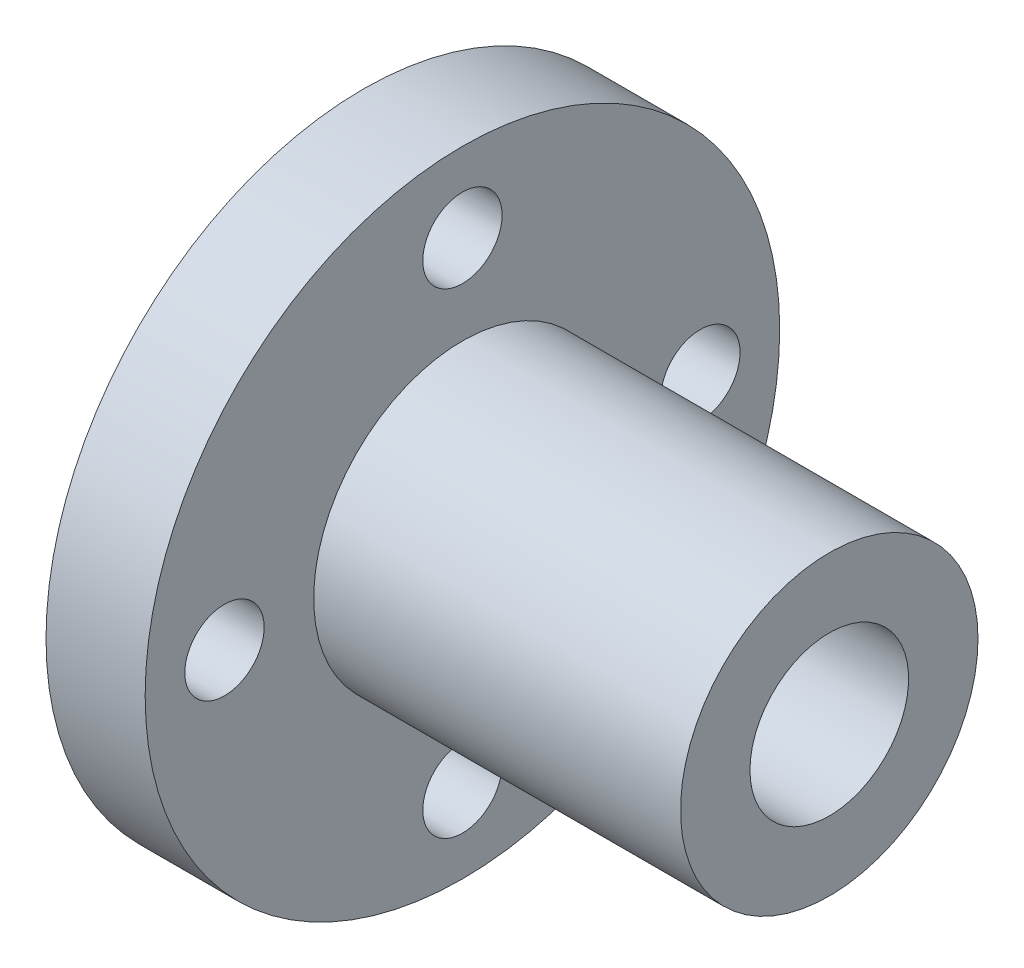
ISO-10303-21;
HEADER;
FILE_DESCRIPTION(('STEP AP214'),'2;1');
FILE_NAME('part.step','',(''),(''),'','','');
FILE_SCHEMA(('AUTOMOTIVE_DESIGN { 1 0 10303 214 1 1 1 1 }'));
ENDSEC;
DATA;
#1=APPLICATION_CONTEXT('core data for automotive mechanical design processes');
#2=APPLICATION_PROTOCOL_DEFINITION('international standard','automotive_design',2000,#1);
#3=PRODUCT_CONTEXT('',#1,'mechanical');
#4=PRODUCT('Part','Part','',(#3));
#5=PRODUCT_RELATED_PRODUCT_CATEGORY('part','',(#4));
#6=PRODUCT_DEFINITION_FORMATION('','',#4);
#7=PRODUCT_DEFINITION_CONTEXT('part definition',#1,'design');
#8=PRODUCT_DEFINITION('design','',#6,#7);
#9=PRODUCT_DEFINITION_SHAPE('','',#8);
#10=(LENGTH_UNIT() NAMED_UNIT(*) SI_UNIT(.MILLI.,.METRE.));
#11=(NAMED_UNIT(*) PLANE_ANGLE_UNIT() SI_UNIT($,.RADIAN.));
#12=(NAMED_UNIT(*) SI_UNIT($,.STERADIAN.) SOLID_ANGLE_UNIT());
#13=UNCERTAINTY_MEASURE_WITH_UNIT(LENGTH_MEASURE(1.E-05),#10,'distance_accuracy_value','');
#14=(GEOMETRIC_REPRESENTATION_CONTEXT(3) GLOBAL_UNCERTAINTY_ASSIGNED_CONTEXT((#13)) GLOBAL_UNIT_ASSIGNED_CONTEXT((#10,
#11,#12)) REPRESENTATION_CONTEXT('',''));
#15=CARTESIAN_POINT('',(0.,0.,0.));
#16=DIRECTION('',(0.,0.,1.));
#17=DIRECTION('',(1.,0.,0.));
#18=AXIS2_PLACEMENT_3D('',#15,#16,#17);
#19=CARTESIAN_POINT('',(5.,0.,0.));
#20=DIRECTION('',(1.,0.,0.));
#21=DIRECTION('',(0.,0.,-1.));
#22=AXIS2_PLACEMENT_3D('',#19,#20,#21);
#23=PLANE('',#22);
#24=CARTESIAN_POINT('',(5.,0.,0.));
#25=DIRECTION('',(1.,0.,0.));
#26=DIRECTION('',(0.,0.,-1.));
#27=AXIS2_PLACEMENT_3D('',#24,#25,#26);
#28=CIRCLE('',#27,7.5);
#29=CARTESIAN_POINT('',(5.,0.,-7.5));
#30=VERTEX_POINT('',#29);
#31=EDGE_CURVE('E67',#30,#30,#28,.T.);
#32=ORIENTED_EDGE('',*,*,#31,.F.);
#33=EDGE_LOOP('',(#32));
#34=FACE_BOUND('',#33,.T.);
#35=CARTESIAN_POINT('',(5.,-12.,-6.79181874011743E-13));
#36=DIRECTION('',(1.,0.,0.));
#37=DIRECTION('',(0.,0.,-1.));
#38=AXIS2_PLACEMENT_3D('',#35,#36,#37);
#39=CIRCLE('',#38,2.00000000000073);
#40=CARTESIAN_POINT('',(5.,-12.,-2.00000000000141));
#41=VERTEX_POINT('',#40);
#42=EDGE_CURVE('E52',#41,#41,#39,.T.);
#43=ORIENTED_EDGE('',*,*,#42,.F.);
#44=EDGE_LOOP('',(#43));
#45=FACE_BOUND('',#44,.T.);
#46=CARTESIAN_POINT('',(5.,12.,0.));
#47=DIRECTION('',(1.,0.,0.));
#48=DIRECTION('',(0.,0.,-1.));
#49=AXIS2_PLACEMENT_3D('',#46,#47,#48);
#50=CIRCLE('',#49,2.);
#51=CARTESIAN_POINT('',(5.,12.,-2.));
#52=VERTEX_POINT('',#51);
#53=EDGE_CURVE('E41',#52,#52,#50,.T.);
#54=ORIENTED_EDGE('',*,*,#53,.F.);
#55=EDGE_LOOP('',(#54));
#56=FACE_BOUND('',#55,.T.);
#57=CARTESIAN_POINT('',(5.,0.,0.));
#58=DIRECTION('',(1.,0.,0.));
#59=DIRECTION('',(0.,0.,-1.));
#60=AXIS2_PLACEMENT_3D('',#57,#58,#59);
#61=CIRCLE('',#60,16.);
#62=CARTESIAN_POINT('',(5.,0.,-16.));
#63=VERTEX_POINT('',#62);
#64=EDGE_CURVE('E10',#63,#63,#61,.T.);
#65=ORIENTED_EDGE('',*,*,#64,.T.);
#66=EDGE_LOOP('',(#65));
#67=FACE_BOUND('',#66,.T.);
#68=CARTESIAN_POINT('',(5.,3.39590937005871E-13,-12.0000000000003));
#69=DIRECTION('',(1.,0.,0.));
#70=DIRECTION('',(0.,0.,-1.));
#71=AXIS2_PLACEMENT_3D('',#68,#69,#70);
#72=CIRCLE('',#71,2.00000000000027);
#73=CARTESIAN_POINT('',(5.,3.39590937005871E-13,-14.0000000000006));
#74=VERTEX_POINT('',#73);
#75=EDGE_CURVE('E46',#74,#74,#72,.T.);
#76=ORIENTED_EDGE('',*,*,#75,.F.);
#77=EDGE_LOOP('',(#76));
#78=FACE_BOUND('',#77,.T.);
#79=CARTESIAN_POINT('',(5.,-3.41060513164848E-13,11.9999999999997));
#80=DIRECTION('',(1.,0.,0.));
#81=DIRECTION('',(0.,0.,-1.));
#82=AXIS2_PLACEMENT_3D('',#79,#80,#81);
#83=CIRCLE('',#82,2.00000000000054);
#84=CARTESIAN_POINT('',(5.,-3.41060513164848E-13,9.99999999999912));
#85=VERTEX_POINT('',#84);
#86=EDGE_CURVE('E58',#85,#85,#83,.T.);
#87=ORIENTED_EDGE('',*,*,#86,.F.);
#88=EDGE_LOOP('',(#87));
#89=FACE_BOUND('',#88,.T.);
#90=ADVANCED_FACE('F30',(#34,#45,#56,#67,#78,#89),#23,.T.);
#91=CARTESIAN_POINT('',(0.,0.,0.));
#92=DIRECTION('',(1.,0.,0.));
#93=DIRECTION('',(0.,0.,-1.));
#94=AXIS2_PLACEMENT_3D('',#91,#92,#93);
#95=PLANE('',#94);
#96=CARTESIAN_POINT('',(0.,0.,0.));
#97=DIRECTION('',(1.,0.,0.));
#98=DIRECTION('',(0.,0.,-1.));
#99=AXIS2_PLACEMENT_3D('',#96,#97,#98);
#100=CIRCLE('',#99,4.);
#101=CARTESIAN_POINT('',(0.,0.,-4.));
#102=VERTEX_POINT('',#101);
#103=EDGE_CURVE('E70',#102,#102,#100,.T.);
#104=ORIENTED_EDGE('',*,*,#103,.T.);
#105=EDGE_LOOP('',(#104));
#106=FACE_BOUND('',#105,.T.);
#107=CARTESIAN_POINT('',(0.,0.,0.));
#108=DIRECTION('',(1.,0.,0.));
#109=DIRECTION('',(0.,0.,-1.));
#110=AXIS2_PLACEMENT_3D('',#107,#108,#109);
#111=CIRCLE('',#110,16.);
#112=CARTESIAN_POINT('',(0.,0.,-16.));
#113=VERTEX_POINT('',#112);
#114=EDGE_CURVE('E34',#113,#113,#111,.T.);
#115=ORIENTED_EDGE('',*,*,#114,.F.);
#116=EDGE_LOOP('',(#115));
#117=FACE_BOUND('',#116,.T.);
#118=CARTESIAN_POINT('',(0.,12.,0.));
#119=DIRECTION('',(1.,0.,0.));
#120=DIRECTION('',(0.,0.,-1.));
#121=AXIS2_PLACEMENT_3D('',#118,#119,#120);
#122=CIRCLE('',#121,2.);
#123=CARTESIAN_POINT('',(0.,12.,-2.));
#124=VERTEX_POINT('',#123);
#125=EDGE_CURVE('E43',#124,#124,#122,.T.);
#126=ORIENTED_EDGE('',*,*,#125,.T.);
#127=EDGE_LOOP('',(#126));
#128=FACE_BOUND('',#127,.T.);
#129=CARTESIAN_POINT('',(0.,3.39590937005871E-13,-12.0000000000003));
#130=DIRECTION('',(1.,0.,0.));
#131=DIRECTION('',(0.,0.,-1.));
#132=AXIS2_PLACEMENT_3D('',#129,#130,#131);
#133=CIRCLE('',#132,2.00000000000027);
#134=CARTESIAN_POINT('',(0.,3.39590937005871E-13,-14.0000000000006));
#135=VERTEX_POINT('',#134);
#136=EDGE_CURVE('E49',#135,#135,#133,.T.);
#137=ORIENTED_EDGE('',*,*,#136,.T.);
#138=EDGE_LOOP('',(#137));
#139=FACE_BOUND('',#138,.T.);
#140=CARTESIAN_POINT('',(0.,-12.,-6.79181874011743E-13));
#141=DIRECTION('',(1.,0.,0.));
#142=DIRECTION('',(0.,0.,-1.));
#143=AXIS2_PLACEMENT_3D('',#140,#141,#142);
#144=CIRCLE('',#143,2.00000000000073);
#145=CARTESIAN_POINT('',(0.,-12.,-2.00000000000141));
#146=VERTEX_POINT('',#145);
#147=EDGE_CURVE('E55',#146,#146,#144,.T.);
#148=ORIENTED_EDGE('',*,*,#147,.T.);
#149=EDGE_LOOP('',(#148));
#150=FACE_BOUND('',#149,.T.);
#151=CARTESIAN_POINT('',(0.,-3.41060513164848E-13,11.9999999999997));
#152=DIRECTION('',(1.,0.,0.));
#153=DIRECTION('',(0.,0.,-1.));
#154=AXIS2_PLACEMENT_3D('',#151,#152,#153);
#155=CIRCLE('',#154,2.00000000000054);
#156=CARTESIAN_POINT('',(0.,-3.41060513164848E-13,9.99999999999912));
#157=VERTEX_POINT('',#156);
#158=EDGE_CURVE('E61',#157,#157,#155,.T.);
#159=ORIENTED_EDGE('',*,*,#158,.T.);
#160=EDGE_LOOP('',(#159));
#161=FACE_BOUND('',#160,.T.);
#162=ADVANCED_FACE('F88',(#106,#117,#128,#139,#150,#161),#95,.F.);
#163=CARTESIAN_POINT('',(5.,0.,0.));
#164=DIRECTION('',(-1.,0.,0.));
#165=DIRECTION('',(0.,0.,1.));
#166=AXIS2_PLACEMENT_3D('',#163,#164,#165);
#167=CYLINDRICAL_SURFACE('',#166,16.);
#168=ORIENTED_EDGE('',*,*,#64,.F.);
#169=EDGE_LOOP('',(#168));
#170=FACE_BOUND('',#169,.T.);
#171=ORIENTED_EDGE('',*,*,#114,.T.);
#172=EDGE_LOOP('',(#171));
#173=FACE_BOUND('',#172,.T.);
#174=ADVANCED_FACE('F32',(#170,#173),#167,.T.);
#175=CARTESIAN_POINT('',(5.,12.,0.));
#176=DIRECTION('',(-1.,0.,0.));
#177=DIRECTION('',(0.,0.,1.));
#178=AXIS2_PLACEMENT_3D('',#175,#176,#177);
#179=CYLINDRICAL_SURFACE('',#178,2.);
#180=ORIENTED_EDGE('',*,*,#53,.T.);
#181=EDGE_LOOP('',(#180));
#182=FACE_BOUND('',#181,.T.);
#183=ORIENTED_EDGE('',*,*,#125,.F.);
#184=EDGE_LOOP('',(#183));
#185=FACE_BOUND('',#184,.T.);
#186=ADVANCED_FACE('F124',(#182,#185),#179,.F.);
#187=CARTESIAN_POINT('',(5.,3.39590937005871E-13,-12.0000000000003));
#188=DIRECTION('',(-1.,0.,0.));
#189=DIRECTION('',(0.,0.,1.));
#190=AXIS2_PLACEMENT_3D('',#187,#188,#189);
#191=CYLINDRICAL_SURFACE('',#190,2.00000000000027);
#192=ORIENTED_EDGE('',*,*,#75,.T.);
#193=EDGE_LOOP('',(#192));
#194=FACE_BOUND('',#193,.T.);
#195=ORIENTED_EDGE('',*,*,#136,.F.);
#196=EDGE_LOOP('',(#195));
#197=FACE_BOUND('',#196,.T.);
#198=ADVANCED_FACE('F113',(#194,#197),#191,.F.);
#199=CARTESIAN_POINT('',(5.,-12.,-6.79181874011743E-13));
#200=DIRECTION('',(-1.,0.,0.));
#201=DIRECTION('',(0.,0.,1.));
#202=AXIS2_PLACEMENT_3D('',#199,#200,#201);
#203=CYLINDRICAL_SURFACE('',#202,2.00000000000073);
#204=ORIENTED_EDGE('',*,*,#42,.T.);
#205=EDGE_LOOP('',(#204));
#206=FACE_BOUND('',#205,.T.);
#207=ORIENTED_EDGE('',*,*,#147,.F.);
#208=EDGE_LOOP('',(#207));
#209=FACE_BOUND('',#208,.T.);
#210=ADVANCED_FACE('F104',(#206,#209),#203,.F.);
#211=CARTESIAN_POINT('',(5.,-3.41060513164848E-13,11.9999999999997));
#212=DIRECTION('',(-1.,0.,0.));
#213=DIRECTION('',(0.,0.,1.));
#214=AXIS2_PLACEMENT_3D('',#211,#212,#213);
#215=CYLINDRICAL_SURFACE('',#214,2.00000000000054);
#216=ORIENTED_EDGE('',*,*,#86,.T.);
#217=EDGE_LOOP('',(#216));
#218=FACE_BOUND('',#217,.T.);
#219=ORIENTED_EDGE('',*,*,#158,.F.);
#220=EDGE_LOOP('',(#219));
#221=FACE_BOUND('',#220,.T.);
#222=ADVANCED_FACE('F101',(#218,#221),#215,.F.);
#223=CARTESIAN_POINT('',(23.5,0.,0.));
#224=DIRECTION('',(-1.,0.,0.));
#225=DIRECTION('',(0.,0.,1.));
#226=AXIS2_PLACEMENT_3D('',#223,#224,#225);
#227=CYLINDRICAL_SURFACE('',#226,7.5);
#228=CARTESIAN_POINT('',(23.5,0.,0.));
#229=DIRECTION('',(1.,0.,0.));
#230=DIRECTION('',(0.,0.,-1.));
#231=AXIS2_PLACEMENT_3D('',#228,#229,#230);
#232=CIRCLE('',#231,7.5);
#233=CARTESIAN_POINT('',(23.5,0.,-7.5));
#234=VERTEX_POINT('',#233);
#235=EDGE_CURVE('E64',#234,#234,#232,.T.);
#236=ORIENTED_EDGE('',*,*,#235,.F.);
#237=EDGE_LOOP('',(#236));
#238=FACE_BOUND('',#237,.T.);
#239=ORIENTED_EDGE('',*,*,#31,.T.);
#240=EDGE_LOOP('',(#239));
#241=FACE_BOUND('',#240,.T.);
#242=ADVANCED_FACE('F103',(#238,#241),#227,.T.);
#243=CARTESIAN_POINT('',(23.5,0.,0.));
#244=DIRECTION('',(1.,0.,0.));
#245=DIRECTION('',(0.,0.,-1.));
#246=AXIS2_PLACEMENT_3D('',#243,#244,#245);
#247=PLANE('',#246);
#248=CARTESIAN_POINT('',(23.5,0.,0.));
#249=DIRECTION('',(-1.,0.,0.));
#250=DIRECTION('',(0.,0.,1.));
#251=AXIS2_PLACEMENT_3D('',#248,#249,#250);
#252=CIRCLE('',#251,4.);
#253=CARTESIAN_POINT('',(23.5,0.,4.));
#254=VERTEX_POINT('',#253);
#255=EDGE_CURVE('E75',#254,#254,#252,.T.);
#256=ORIENTED_EDGE('',*,*,#255,.T.);
#257=EDGE_LOOP('',(#256));
#258=FACE_BOUND('',#257,.T.);
#259=ORIENTED_EDGE('',*,*,#235,.T.);
#260=EDGE_LOOP('',(#259));
#261=FACE_BOUND('',#260,.T.);
#262=ADVANCED_FACE('F79',(#258,#261),#247,.T.);
#263=CARTESIAN_POINT('',(23.5,0.,0.));
#264=DIRECTION('',(-1.,0.,0.));
#265=DIRECTION('',(0.,0.,1.));
#266=AXIS2_PLACEMENT_3D('',#263,#264,#265);
#267=CYLINDRICAL_SURFACE('',#266,4.);
#268=ORIENTED_EDGE('',*,*,#255,.F.);
#269=EDGE_LOOP('',(#268));
#270=FACE_BOUND('',#269,.T.);
#271=ORIENTED_EDGE('',*,*,#103,.F.);
#272=EDGE_LOOP('',(#271));
#273=FACE_BOUND('',#272,.T.);
#274=ADVANCED_FACE('F82',(#270,#273),#267,.F.);
#275=CLOSED_SHELL('',(#90,#162,#174,#186,#198,#210,#222,#242,#262,#274));
#276=MANIFOLD_SOLID_BREP('B2',#275);
#277=ADVANCED_BREP_SHAPE_REPRESENTATION('',(#18,#276),#14);
#278=SHAPE_DEFINITION_REPRESENTATION(#9,#277);
ENDSEC;
END-ISO-10303-21;
